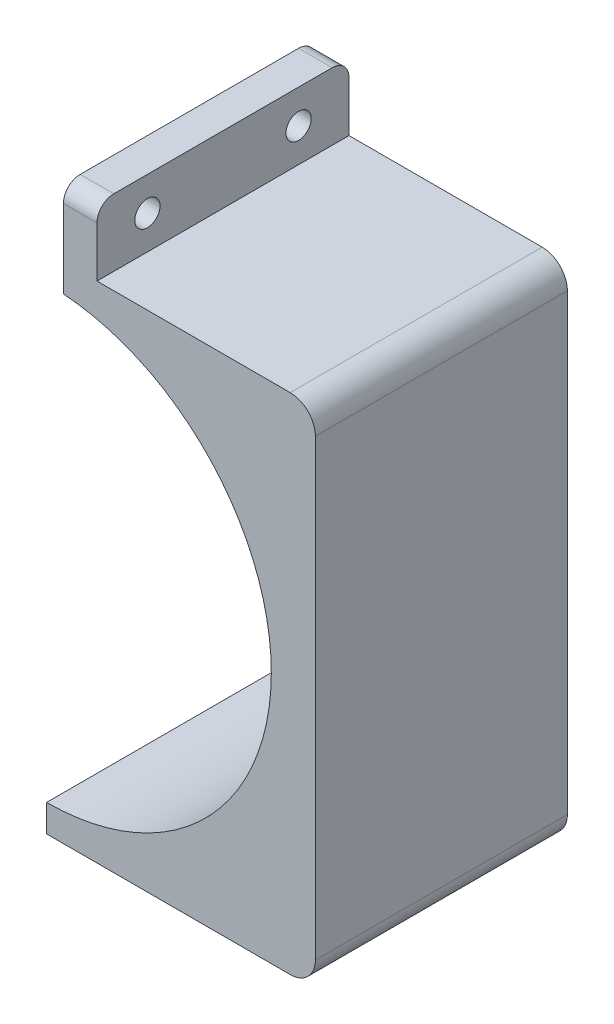
ISO-10303-21;
HEADER;
FILE_DESCRIPTION(('STEP AP214'),'2;1');
FILE_NAME('part.step','',(''),(''),'','','');
FILE_SCHEMA(('AUTOMOTIVE_DESIGN { 1 0 10303 214 1 1 1 1 }'));
ENDSEC;
DATA;
#1=APPLICATION_CONTEXT('core data for automotive mechanical design processes');
#2=APPLICATION_PROTOCOL_DEFINITION('international standard','automotive_design',2000,#1);
#3=PRODUCT_CONTEXT('',#1,'mechanical');
#4=PRODUCT('Part','Part','',(#3));
#5=PRODUCT_RELATED_PRODUCT_CATEGORY('part','',(#4));
#6=PRODUCT_DEFINITION_FORMATION('','',#4);
#7=PRODUCT_DEFINITION_CONTEXT('part definition',#1,'design');
#8=PRODUCT_DEFINITION('design','',#6,#7);
#9=PRODUCT_DEFINITION_SHAPE('','',#8);
#10=(LENGTH_UNIT() NAMED_UNIT(*) SI_UNIT(.MILLI.,.METRE.));
#11=(NAMED_UNIT(*) PLANE_ANGLE_UNIT() SI_UNIT($,.RADIAN.));
#12=(NAMED_UNIT(*) SI_UNIT($,.STERADIAN.) SOLID_ANGLE_UNIT());
#13=UNCERTAINTY_MEASURE_WITH_UNIT(LENGTH_MEASURE(1.E-05),#10,'distance_accuracy_value','');
#14=(GEOMETRIC_REPRESENTATION_CONTEXT(3) GLOBAL_UNCERTAINTY_ASSIGNED_CONTEXT((#13)) GLOBAL_UNIT_ASSIGNED_CONTEXT((#10,
#11,#12)) REPRESENTATION_CONTEXT('',''));
#15=CARTESIAN_POINT('',(0.,0.,0.));
#16=DIRECTION('',(0.,0.,1.));
#17=DIRECTION('',(1.,0.,0.));
#18=AXIS2_PLACEMENT_3D('',#15,#16,#17);
#19=CARTESIAN_POINT('',(32.,30.,30.));
#20=DIRECTION('',(-1.,0.,0.));
#21=DIRECTION('',(0.,-1.,0.));
#22=AXIS2_PLACEMENT_3D('',#19,#20,#21);
#23=PLANE('',#22);
#24=DIRECTION('',(0.,1.,0.));
#25=VECTOR('',#24,1.);
#26=CARTESIAN_POINT('',(32.,30.,30.));
#27=LINE('',#26,#25);
#28=CARTESIAN_POINT('',(32.,-27.,30.));
#29=VERTEX_POINT('',#28);
#30=CARTESIAN_POINT('',(32.,27.,30.));
#31=VERTEX_POINT('',#30);
#32=EDGE_CURVE('E156',#29,#31,#27,.T.);
#33=ORIENTED_EDGE('',*,*,#32,.F.);
#34=DIRECTION('',(0.,0.,-1.));
#35=VECTOR('',#34,1.);
#36=CARTESIAN_POINT('',(32.,-27.,30.));
#37=LINE('',#36,#35);
#38=CARTESIAN_POINT('',(32.,-27.,0.));
#39=VERTEX_POINT('',#38);
#40=EDGE_CURVE('E180',#29,#39,#37,.T.);
#41=ORIENTED_EDGE('',*,*,#40,.T.);
#42=DIRECTION('',(0.,1.,0.));
#43=VECTOR('',#42,1.);
#44=CARTESIAN_POINT('',(32.,30.,0.));
#45=LINE('',#44,#43);
#46=CARTESIAN_POINT('',(32.,27.,0.));
#47=VERTEX_POINT('',#46);
#48=EDGE_CURVE('E220',#39,#47,#45,.T.);
#49=ORIENTED_EDGE('',*,*,#48,.T.);
#50=DIRECTION('',(0.,0.,-1.));
#51=VECTOR('',#50,1.);
#52=CARTESIAN_POINT('',(32.,27.,30.));
#53=LINE('',#52,#51);
#54=EDGE_CURVE('E178',#47,#31,#53,.F.);
#55=ORIENTED_EDGE('',*,*,#54,.T.);
#56=EDGE_LOOP('',(#33,#41,#49,#55));
#57=FACE_BOUND('',#56,.T.);
#58=ADVANCED_FACE('F39',(#57),#23,.F.);
#59=CARTESIAN_POINT('',(6.,30.,30.));
#60=DIRECTION('',(0.,-1.,0.));
#61=DIRECTION('',(1.,0.,0.));
#62=AXIS2_PLACEMENT_3D('',#59,#60,#61);
#63=PLANE('',#62);
#64=DIRECTION('',(-1.,0.,0.));
#65=VECTOR('',#64,1.);
#66=CARTESIAN_POINT('',(6.,30.,30.));
#67=LINE('',#66,#65);
#68=CARTESIAN_POINT('',(29.,30.,30.));
#69=VERTEX_POINT('',#68);
#70=CARTESIAN_POINT('',(6.,30.,30.));
#71=VERTEX_POINT('',#70);
#72=EDGE_CURVE('E160',#69,#71,#67,.T.);
#73=ORIENTED_EDGE('',*,*,#72,.F.);
#74=DIRECTION('',(0.,0.,-1.));
#75=VECTOR('',#74,1.);
#76=CARTESIAN_POINT('',(29.,30.,30.));
#77=LINE('',#76,#75);
#78=CARTESIAN_POINT('',(29.,30.,0.));
#79=VERTEX_POINT('',#78);
#80=EDGE_CURVE('E142',#69,#79,#77,.T.);
#81=ORIENTED_EDGE('',*,*,#80,.T.);
#82=DIRECTION('',(-1.,0.,0.));
#83=VECTOR('',#82,1.);
#84=CARTESIAN_POINT('',(6.,30.,0.));
#85=LINE('',#84,#83);
#86=CARTESIAN_POINT('',(6.,30.,0.));
#87=VERTEX_POINT('',#86);
#88=EDGE_CURVE('E216',#79,#87,#85,.T.);
#89=ORIENTED_EDGE('',*,*,#88,.T.);
#90=DIRECTION('',(0.,0.,-1.));
#91=VECTOR('',#90,1.);
#92=CARTESIAN_POINT('',(6.,30.,30.));
#93=LINE('',#92,#91);
#94=EDGE_CURVE('E175',#71,#87,#93,.T.);
#95=ORIENTED_EDGE('',*,*,#94,.F.);
#96=EDGE_LOOP('',(#73,#81,#89,#95));
#97=FACE_BOUND('',#96,.T.);
#98=ADVANCED_FACE('F271',(#97),#63,.F.);
#99=CARTESIAN_POINT('',(6.,38.,30.));
#100=DIRECTION('',(-1.,0.,0.));
#101=DIRECTION('',(0.,-1.,0.));
#102=AXIS2_PLACEMENT_3D('',#99,#100,#101);
#103=PLANE('',#102);
#104=CARTESIAN_POINT('',(6.00000000000001,34.,24.));
#105=DIRECTION('',(1.,0.,0.));
#106=DIRECTION('',(0.,1.,0.));
#107=AXIS2_PLACEMENT_3D('',#104,#105,#106);
#108=CIRCLE('',#107,1.5);
#109=CARTESIAN_POINT('',(6.00000000000001,35.5,24.));
#110=VERTEX_POINT('',#109);
#111=EDGE_CURVE('E250',#110,#110,#108,.T.);
#112=ORIENTED_EDGE('',*,*,#111,.F.);
#113=EDGE_LOOP('',(#112));
#114=FACE_BOUND('',#113,.T.);
#115=CARTESIAN_POINT('',(6.00000000000001,34.,6.));
#116=DIRECTION('',(1.,0.,0.));
#117=DIRECTION('',(0.,1.,0.));
#118=AXIS2_PLACEMENT_3D('',#115,#116,#117);
#119=CIRCLE('',#118,1.5);
#120=CARTESIAN_POINT('',(6.00000000000001,35.5,6.));
#121=VERTEX_POINT('',#120);
#122=EDGE_CURVE('E251',#121,#121,#119,.T.);
#123=ORIENTED_EDGE('',*,*,#122,.F.);
#124=EDGE_LOOP('',(#123));
#125=FACE_BOUND('',#124,.T.);
#126=DIRECTION('',(0.,1.,0.));
#127=VECTOR('',#126,1.);
#128=CARTESIAN_POINT('',(6.,38.,0.));
#129=LINE('',#128,#127);
#130=CARTESIAN_POINT('',(6.,36.,0.));
#131=VERTEX_POINT('',#130);
#132=EDGE_CURVE('E205',#87,#131,#129,.T.);
#133=ORIENTED_EDGE('',*,*,#132,.T.);
#134=CARTESIAN_POINT('',(6.,36.,2.));
#135=DIRECTION('',(-1.,0.,0.));
#136=DIRECTION('',(0.,-1.,0.));
#137=AXIS2_PLACEMENT_3D('',#134,#135,#136);
#138=CIRCLE('',#137,2.);
#139=CARTESIAN_POINT('',(6.,38.,2.));
#140=VERTEX_POINT('',#139);
#141=EDGE_CURVE('E47',#131,#140,#138,.F.);
#142=ORIENTED_EDGE('',*,*,#141,.T.);
#143=DIRECTION('',(0.,0.,-1.));
#144=VECTOR('',#143,1.);
#145=CARTESIAN_POINT('',(6.,38.,30.));
#146=LINE('',#145,#144);
#147=CARTESIAN_POINT('',(6.,38.,28.));
#148=VERTEX_POINT('',#147);
#149=EDGE_CURVE('E172',#148,#140,#146,.T.);
#150=ORIENTED_EDGE('',*,*,#149,.F.);
#151=CARTESIAN_POINT('',(6.,36.,28.));
#152=DIRECTION('',(-1.,0.,0.));
#153=DIRECTION('',(0.,-1.,0.));
#154=AXIS2_PLACEMENT_3D('',#151,#152,#153);
#155=CIRCLE('',#154,2.);
#156=CARTESIAN_POINT('',(6.,36.,30.));
#157=VERTEX_POINT('',#156);
#158=EDGE_CURVE('E54',#148,#157,#155,.F.);
#159=ORIENTED_EDGE('',*,*,#158,.T.);
#160=DIRECTION('',(0.,1.,0.));
#161=VECTOR('',#160,1.);
#162=CARTESIAN_POINT('',(6.,38.,30.));
#163=LINE('',#162,#161);
#164=EDGE_CURVE('E230',#71,#157,#163,.T.);
#165=ORIENTED_EDGE('',*,*,#164,.F.);
#166=ORIENTED_EDGE('',*,*,#94,.T.);
#167=EDGE_LOOP('',(#133,#142,#150,#159,#165,#166));
#168=FACE_BOUND('',#167,.T.);
#169=ADVANCED_FACE('F204',(#114,#125,#168),#103,.F.);
#170=CARTESIAN_POINT('',(2.,38.,30.));
#171=DIRECTION('',(0.,-1.,0.));
#172=DIRECTION('',(0.,0.,-1.));
#173=AXIS2_PLACEMENT_3D('',#170,#171,#172);
#174=PLANE('',#173);
#175=ORIENTED_EDGE('',*,*,#149,.T.);
#176=DIRECTION('',(-1.,0.,0.));
#177=VECTOR('',#176,1.);
#178=CARTESIAN_POINT('',(2.,38.,2.));
#179=LINE('',#178,#177);
#180=CARTESIAN_POINT('',(2.,38.,2.));
#181=VERTEX_POINT('',#180);
#182=EDGE_CURVE('E195',#140,#181,#179,.T.);
#183=ORIENTED_EDGE('',*,*,#182,.T.);
#184=DIRECTION('',(0.,0.,-1.));
#185=VECTOR('',#184,1.);
#186=CARTESIAN_POINT('',(2.,38.,30.));
#187=LINE('',#186,#185);
#188=CARTESIAN_POINT('',(2.,38.,28.));
#189=VERTEX_POINT('',#188);
#190=EDGE_CURVE('E169',#189,#181,#187,.T.);
#191=ORIENTED_EDGE('',*,*,#190,.F.);
#192=DIRECTION('',(-1.,0.,0.));
#193=VECTOR('',#192,1.);
#194=CARTESIAN_POINT('',(6.,38.,28.));
#195=LINE('',#194,#193);
#196=EDGE_CURVE('E141',#189,#148,#195,.F.);
#197=ORIENTED_EDGE('',*,*,#196,.T.);
#198=EDGE_LOOP('',(#175,#183,#191,#197));
#199=FACE_BOUND('',#198,.T.);
#200=ADVANCED_FACE('F209',(#199),#174,.F.);
#201=CARTESIAN_POINT('',(2.,28.6593480251097,30.));
#202=DIRECTION('',(1.,0.,0.));
#203=DIRECTION('',(0.,1.,0.));
#204=AXIS2_PLACEMENT_3D('',#201,#202,#203);
#205=PLANE('',#204);
#206=CARTESIAN_POINT('',(2.,34.,24.));
#207=DIRECTION('',(1.,0.,0.));
#208=DIRECTION('',(0.,1.,0.));
#209=AXIS2_PLACEMENT_3D('',#206,#207,#208);
#210=CIRCLE('',#209,1.5);
#211=CARTESIAN_POINT('',(2.,35.5,24.));
#212=VERTEX_POINT('',#211);
#213=EDGE_CURVE('E237',#212,#212,#210,.T.);
#214=ORIENTED_EDGE('',*,*,#213,.T.);
#215=EDGE_LOOP('',(#214));
#216=FACE_BOUND('',#215,.T.);
#217=CARTESIAN_POINT('',(2.,34.,6.));
#218=DIRECTION('',(1.,0.,0.));
#219=DIRECTION('',(0.,1.,0.));
#220=AXIS2_PLACEMENT_3D('',#217,#218,#219);
#221=CIRCLE('',#220,1.5);
#222=CARTESIAN_POINT('',(2.,35.5,6.));
#223=VERTEX_POINT('',#222);
#224=EDGE_CURVE('E247',#223,#223,#221,.T.);
#225=ORIENTED_EDGE('',*,*,#224,.T.);
#226=EDGE_LOOP('',(#225));
#227=FACE_BOUND('',#226,.T.);
#228=ORIENTED_EDGE('',*,*,#190,.T.);
#229=CARTESIAN_POINT('',(2.,36.,2.));
#230=DIRECTION('',(1.,0.,0.));
#231=DIRECTION('',(0.,1.,0.));
#232=AXIS2_PLACEMENT_3D('',#229,#230,#231);
#233=CIRCLE('',#232,2.);
#234=CARTESIAN_POINT('',(2.,36.,0.));
#235=VERTEX_POINT('',#234);
#236=EDGE_CURVE('E200',#181,#235,#233,.F.);
#237=ORIENTED_EDGE('',*,*,#236,.T.);
#238=DIRECTION('',(0.,-1.,0.));
#239=VECTOR('',#238,1.);
#240=CARTESIAN_POINT('',(2.,28.6593480251097,0.));
#241=LINE('',#240,#239);
#242=CARTESIAN_POINT('',(2.,26.6751288656681,0.));
#243=VERTEX_POINT('',#242);
#244=EDGE_CURVE('E162',#235,#243,#241,.T.);
#245=ORIENTED_EDGE('',*,*,#244,.T.);
#246=DIRECTION('',(0.,0.,-1.));
#247=VECTOR('',#246,1.);
#248=CARTESIAN_POINT('',(2.,26.6751288656681,30.));
#249=LINE('',#248,#247);
#250=CARTESIAN_POINT('',(2.,26.6751288656681,30.));
#251=VERTEX_POINT('',#250);
#252=EDGE_CURVE('E166',#251,#243,#249,.T.);
#253=ORIENTED_EDGE('',*,*,#252,.F.);
#254=DIRECTION('',(0.,-1.,0.));
#255=VECTOR('',#254,1.);
#256=CARTESIAN_POINT('',(2.,38.,30.));
#257=LINE('',#256,#255);
#258=CARTESIAN_POINT('',(2.,36.,30.));
#259=VERTEX_POINT('',#258);
#260=EDGE_CURVE('E228',#259,#251,#257,.T.);
#261=ORIENTED_EDGE('',*,*,#260,.F.);
#262=CARTESIAN_POINT('',(2.,36.,28.));
#263=DIRECTION('',(1.,0.,0.));
#264=DIRECTION('',(0.,1.,0.));
#265=AXIS2_PLACEMENT_3D('',#262,#263,#264);
#266=CIRCLE('',#265,2.);
#267=EDGE_CURVE('E198',#259,#189,#266,.F.);
#268=ORIENTED_EDGE('',*,*,#267,.T.);
#269=EDGE_LOOP('',(#228,#237,#245,#253,#261,#268));
#270=FACE_BOUND('',#269,.T.);
#271=ADVANCED_FACE('F214',(#216,#227,#270),#205,.F.);
#272=CARTESIAN_POINT('',(0.,0.,30.));
#273=DIRECTION('',(0.,0.,-1.));
#274=DIRECTION('',(-1.,0.,0.));
#275=AXIS2_PLACEMENT_3D('',#272,#273,#274);
#276=CYLINDRICAL_SURFACE('',#275,26.75);
#277=CARTESIAN_POINT('',(0.,0.,0.));
#278=DIRECTION('',(0.,0.,-1.));
#279=DIRECTION('',(1.,0.,0.));
#280=AXIS2_PLACEMENT_3D('',#277,#278,#279);
#281=CIRCLE('',#280,26.75);
#282=CARTESIAN_POINT('',(0.,-26.75,0.));
#283=VERTEX_POINT('',#282);
#284=EDGE_CURVE('E157',#243,#283,#281,.T.);
#285=ORIENTED_EDGE('',*,*,#284,.T.);
#286=DIRECTION('',(0.,0.,-1.));
#287=VECTOR('',#286,1.);
#288=CARTESIAN_POINT('',(0.,-26.75,30.));
#289=LINE('',#288,#287);
#290=CARTESIAN_POINT('',(0.,-26.75,30.));
#291=VERTEX_POINT('',#290);
#292=EDGE_CURVE('E137',#283,#291,#289,.F.);
#293=ORIENTED_EDGE('',*,*,#292,.T.);
#294=CARTESIAN_POINT('',(0.,0.,30.));
#295=DIRECTION('',(0.,0.,-1.));
#296=DIRECTION('',(1.,0.,0.));
#297=AXIS2_PLACEMENT_3D('',#294,#295,#296);
#298=CIRCLE('',#297,26.75);
#299=EDGE_CURVE('E225',#251,#291,#298,.T.);
#300=ORIENTED_EDGE('',*,*,#299,.F.);
#301=ORIENTED_EDGE('',*,*,#252,.T.);
#302=EDGE_LOOP('',(#285,#293,#300,#301));
#303=FACE_BOUND('',#302,.T.);
#304=ADVANCED_FACE('F260',(#303),#276,.F.);
#305=CARTESIAN_POINT('',(-32.,-30.,30.));
#306=DIRECTION('',(0.,1.,0.));
#307=DIRECTION('',(0.,0.,1.));
#308=AXIS2_PLACEMENT_3D('',#305,#306,#307);
#309=PLANE('',#308);
#310=CARTESIAN_POINT('',(19.,-30.,24.));
#311=DIRECTION('',(0.,-1.,0.));
#312=DIRECTION('',(0.,0.,-1.));
#313=AXIS2_PLACEMENT_3D('',#310,#311,#312);
#314=CIRCLE('',#313,2.);
#315=CARTESIAN_POINT('',(19.,-30.,22.));
#316=VERTEX_POINT('',#315);
#317=EDGE_CURVE('E240',#316,#316,#314,.T.);
#318=ORIENTED_EDGE('',*,*,#317,.F.);
#319=EDGE_LOOP('',(#318));
#320=FACE_BOUND('',#319,.T.);
#321=CARTESIAN_POINT('',(19.,-30.,6.));
#322=DIRECTION('',(0.,-1.,0.));
#323=DIRECTION('',(0.,0.,-1.));
#324=AXIS2_PLACEMENT_3D('',#321,#322,#323);
#325=CIRCLE('',#324,2.);
#326=CARTESIAN_POINT('',(19.,-30.,4.));
#327=VERTEX_POINT('',#326);
#328=EDGE_CURVE('E236',#327,#327,#325,.T.);
#329=ORIENTED_EDGE('',*,*,#328,.F.);
#330=EDGE_LOOP('',(#329));
#331=FACE_BOUND('',#330,.T.);
#332=DIRECTION('',(1.,0.,0.));
#333=VECTOR('',#332,1.);
#334=CARTESIAN_POINT('',(-32.,-30.,30.));
#335=LINE('',#334,#333);
#336=CARTESIAN_POINT('',(0.,-30.,30.));
#337=VERTEX_POINT('',#336);
#338=CARTESIAN_POINT('',(29.,-30.,30.));
#339=VERTEX_POINT('',#338);
#340=EDGE_CURVE('E150',#337,#339,#335,.T.);
#341=ORIENTED_EDGE('',*,*,#340,.F.);
#342=DIRECTION('',(0.,0.,-1.));
#343=VECTOR('',#342,1.);
#344=CARTESIAN_POINT('',(0.,-30.,30.));
#345=LINE('',#344,#343);
#346=CARTESIAN_POINT('',(0.,-30.,0.));
#347=VERTEX_POINT('',#346);
#348=EDGE_CURVE('E134',#337,#347,#345,.T.);
#349=ORIENTED_EDGE('',*,*,#348,.T.);
#350=DIRECTION('',(1.,0.,0.));
#351=VECTOR('',#350,1.);
#352=CARTESIAN_POINT('',(-32.,-30.,0.));
#353=LINE('',#352,#351);
#354=CARTESIAN_POINT('',(29.,-30.,0.));
#355=VERTEX_POINT('',#354);
#356=EDGE_CURVE('E148',#347,#355,#353,.T.);
#357=ORIENTED_EDGE('',*,*,#356,.T.);
#358=DIRECTION('',(0.,0.,-1.));
#359=VECTOR('',#358,1.);
#360=CARTESIAN_POINT('',(29.,-30.,30.));
#361=LINE('',#360,#359);
#362=EDGE_CURVE('E186',#355,#339,#361,.F.);
#363=ORIENTED_EDGE('',*,*,#362,.T.);
#364=EDGE_LOOP('',(#341,#349,#357,#363));
#365=FACE_BOUND('',#364,.T.);
#366=ADVANCED_FACE('F146',(#320,#331,#365),#309,.F.);
#367=CARTESIAN_POINT('',(0.,0.,30.));
#368=DIRECTION('',(0.,0.,1.));
#369=DIRECTION('',(1.,0.,0.));
#370=AXIS2_PLACEMENT_3D('',#367,#368,#369);
#371=PLANE('',#370);
#372=ORIENTED_EDGE('',*,*,#164,.T.);
#373=DIRECTION('',(-1.,0.,0.));
#374=VECTOR('',#373,1.);
#375=CARTESIAN_POINT('',(2.,36.,30.));
#376=LINE('',#375,#374);
#377=EDGE_CURVE('E11',#157,#259,#376,.T.);
#378=ORIENTED_EDGE('',*,*,#377,.T.);
#379=ORIENTED_EDGE('',*,*,#260,.T.);
#380=ORIENTED_EDGE('',*,*,#299,.T.);
#381=DIRECTION('',(0.,1.,0.));
#382=VECTOR('',#381,1.);
#383=CARTESIAN_POINT('',(0.,0.,30.));
#384=LINE('',#383,#382);
#385=EDGE_CURVE('E254',#337,#291,#384,.T.);
#386=ORIENTED_EDGE('',*,*,#385,.F.);
#387=ORIENTED_EDGE('',*,*,#340,.T.);
#388=CARTESIAN_POINT('',(29.,-27.,30.));
#389=DIRECTION('',(0.,0.,1.));
#390=DIRECTION('',(1.,0.,0.));
#391=AXIS2_PLACEMENT_3D('',#388,#389,#390);
#392=CIRCLE('',#391,3.);
#393=EDGE_CURVE('E190',#339,#29,#392,.T.);
#394=ORIENTED_EDGE('',*,*,#393,.T.);
#395=ORIENTED_EDGE('',*,*,#32,.T.);
#396=CARTESIAN_POINT('',(29.,27.,30.));
#397=DIRECTION('',(0.,0.,1.));
#398=DIRECTION('',(1.,0.,0.));
#399=AXIS2_PLACEMENT_3D('',#396,#397,#398);
#400=CIRCLE('',#399,3.);
#401=EDGE_CURVE('E188',#31,#69,#400,.T.);
#402=ORIENTED_EDGE('',*,*,#401,.T.);
#403=ORIENTED_EDGE('',*,*,#72,.T.);
#404=EDGE_LOOP('',(#372,#378,#379,#380,#386,#387,#394,#395,#402,#403));
#405=FACE_BOUND('',#404,.T.);
#406=ADVANCED_FACE('F262',(#405),#371,.T.);
#407=CARTESIAN_POINT('',(0.,0.,0.));
#408=DIRECTION('',(0.,0.,1.));
#409=DIRECTION('',(1.,0.,0.));
#410=AXIS2_PLACEMENT_3D('',#407,#408,#409);
#411=PLANE('',#410);
#412=ORIENTED_EDGE('',*,*,#244,.F.);
#413=DIRECTION('',(-1.,0.,0.));
#414=VECTOR('',#413,1.);
#415=CARTESIAN_POINT('',(0.,36.,0.));
#416=LINE('',#415,#414);
#417=EDGE_CURVE('E62',#235,#131,#416,.F.);
#418=ORIENTED_EDGE('',*,*,#417,.T.);
#419=ORIENTED_EDGE('',*,*,#132,.F.);
#420=ORIENTED_EDGE('',*,*,#88,.F.);
#421=CARTESIAN_POINT('',(29.,27.,0.));
#422=DIRECTION('',(0.,0.,1.));
#423=DIRECTION('',(1.,0.,0.));
#424=AXIS2_PLACEMENT_3D('',#421,#422,#423);
#425=CIRCLE('',#424,3.);
#426=EDGE_CURVE('E183',#79,#47,#425,.F.);
#427=ORIENTED_EDGE('',*,*,#426,.T.);
#428=ORIENTED_EDGE('',*,*,#48,.F.);
#429=CARTESIAN_POINT('',(29.,-27.,0.));
#430=DIRECTION('',(0.,0.,1.));
#431=DIRECTION('',(1.,0.,0.));
#432=AXIS2_PLACEMENT_3D('',#429,#430,#431);
#433=CIRCLE('',#432,3.);
#434=EDGE_CURVE('E154',#39,#355,#433,.F.);
#435=ORIENTED_EDGE('',*,*,#434,.T.);
#436=ORIENTED_EDGE('',*,*,#356,.F.);
#437=DIRECTION('',(0.,1.,0.));
#438=VECTOR('',#437,1.);
#439=CARTESIAN_POINT('',(0.,0.,0.));
#440=LINE('',#439,#438);
#441=EDGE_CURVE('E131',#347,#283,#440,.T.);
#442=ORIENTED_EDGE('',*,*,#441,.T.);
#443=ORIENTED_EDGE('',*,*,#284,.F.);
#444=EDGE_LOOP('',(#412,#418,#419,#420,#427,#428,#435,#436,#442,#443));
#445=FACE_BOUND('',#444,.T.);
#446=ADVANCED_FACE('F152',(#445),#411,.F.);
#447=CARTESIAN_POINT('',(29.,-27.,30.));
#448=DIRECTION('',(0.,0.,-1.));
#449=DIRECTION('',(-1.,0.,0.));
#450=AXIS2_PLACEMENT_3D('',#447,#448,#449);
#451=CYLINDRICAL_SURFACE('',#450,3.);
#452=ORIENTED_EDGE('',*,*,#393,.F.);
#453=ORIENTED_EDGE('',*,*,#362,.F.);
#454=ORIENTED_EDGE('',*,*,#434,.F.);
#455=ORIENTED_EDGE('',*,*,#40,.F.);
#456=EDGE_LOOP('',(#452,#453,#454,#455));
#457=FACE_BOUND('',#456,.T.);
#458=ADVANCED_FACE('F282',(#457),#451,.T.);
#459=CARTESIAN_POINT('',(29.,27.,30.));
#460=DIRECTION('',(0.,0.,-1.));
#461=DIRECTION('',(-1.,0.,0.));
#462=AXIS2_PLACEMENT_3D('',#459,#460,#461);
#463=CYLINDRICAL_SURFACE('',#462,3.);
#464=ORIENTED_EDGE('',*,*,#401,.F.);
#465=ORIENTED_EDGE('',*,*,#54,.F.);
#466=ORIENTED_EDGE('',*,*,#426,.F.);
#467=ORIENTED_EDGE('',*,*,#80,.F.);
#468=EDGE_LOOP('',(#464,#465,#466,#467));
#469=FACE_BOUND('',#468,.T.);
#470=ADVANCED_FACE('F285',(#469),#463,.T.);
#471=CARTESIAN_POINT('',(19.,-23.,6.));
#472=DIRECTION('',(0.,-1.,0.));
#473=DIRECTION('',(0.,0.,-1.));
#474=AXIS2_PLACEMENT_3D('',#471,#472,#473);
#475=CYLINDRICAL_SURFACE('',#474,2.);
#476=CARTESIAN_POINT('',(19.,-23.,6.));
#477=DIRECTION('',(0.,-1.,0.));
#478=DIRECTION('',(0.,0.,-1.));
#479=AXIS2_PLACEMENT_3D('',#476,#477,#478);
#480=CIRCLE('',#479,2.);
#481=CARTESIAN_POINT('',(19.,-23.,4.));
#482=VERTEX_POINT('',#481);
#483=EDGE_CURVE('E233',#482,#482,#480,.T.);
#484=ORIENTED_EDGE('',*,*,#483,.F.);
#485=EDGE_LOOP('',(#484));
#486=FACE_BOUND('',#485,.T.);
#487=ORIENTED_EDGE('',*,*,#328,.T.);
#488=EDGE_LOOP('',(#487));
#489=FACE_BOUND('',#488,.T.);
#490=ADVANCED_FACE('F288',(#486,#489),#475,.F.);
#491=CARTESIAN_POINT('',(19.,-23.,6.));
#492=DIRECTION('',(0.,-1.,0.));
#493=DIRECTION('',(0.,0.,-1.));
#494=AXIS2_PLACEMENT_3D('',#491,#492,#493);
#495=PLANE('',#494);
#496=ORIENTED_EDGE('',*,*,#483,.T.);
#497=EDGE_LOOP('',(#496));
#498=FACE_BOUND('',#497,.T.);
#499=ADVANCED_FACE('F293',(#498),#495,.T.);
#500=CARTESIAN_POINT('',(19.,-23.,24.));
#501=DIRECTION('',(0.,-1.,0.));
#502=DIRECTION('',(0.,0.,-1.));
#503=AXIS2_PLACEMENT_3D('',#500,#501,#502);
#504=CYLINDRICAL_SURFACE('',#503,2.);
#505=CARTESIAN_POINT('',(19.,-23.,24.));
#506=DIRECTION('',(0.,-1.,0.));
#507=DIRECTION('',(0.,0.,-1.));
#508=AXIS2_PLACEMENT_3D('',#505,#506,#507);
#509=CIRCLE('',#508,2.);
#510=CARTESIAN_POINT('',(19.,-23.,22.));
#511=VERTEX_POINT('',#510);
#512=EDGE_CURVE('E223',#511,#511,#509,.T.);
#513=ORIENTED_EDGE('',*,*,#512,.F.);
#514=EDGE_LOOP('',(#513));
#515=FACE_BOUND('',#514,.T.);
#516=ORIENTED_EDGE('',*,*,#317,.T.);
#517=EDGE_LOOP('',(#516));
#518=FACE_BOUND('',#517,.T.);
#519=ADVANCED_FACE('F307',(#515,#518),#504,.F.);
#520=CARTESIAN_POINT('',(19.,-23.,24.));
#521=DIRECTION('',(0.,-1.,0.));
#522=DIRECTION('',(0.,0.,-1.));
#523=AXIS2_PLACEMENT_3D('',#520,#521,#522);
#524=PLANE('',#523);
#525=ORIENTED_EDGE('',*,*,#512,.T.);
#526=EDGE_LOOP('',(#525));
#527=FACE_BOUND('',#526,.T.);
#528=ADVANCED_FACE('F341',(#527),#524,.T.);
#529=CARTESIAN_POINT('',(-32.,34.,6.));
#530=DIRECTION('',(1.,0.,0.));
#531=DIRECTION('',(0.,1.,0.));
#532=AXIS2_PLACEMENT_3D('',#529,#530,#531);
#533=CYLINDRICAL_SURFACE('',#532,1.5);
#534=ORIENTED_EDGE('',*,*,#122,.T.);
#535=EDGE_LOOP('',(#534));
#536=FACE_BOUND('',#535,.T.);
#537=ORIENTED_EDGE('',*,*,#224,.F.);
#538=EDGE_LOOP('',(#537));
#539=FACE_BOUND('',#538,.T.);
#540=ADVANCED_FACE('F337',(#536,#539),#533,.F.);
#541=CARTESIAN_POINT('',(-32.,34.,24.));
#542=DIRECTION('',(1.,0.,0.));
#543=DIRECTION('',(0.,1.,0.));
#544=AXIS2_PLACEMENT_3D('',#541,#542,#543);
#545=CYLINDRICAL_SURFACE('',#544,1.5);
#546=ORIENTED_EDGE('',*,*,#111,.T.);
#547=EDGE_LOOP('',(#546));
#548=FACE_BOUND('',#547,.T.);
#549=ORIENTED_EDGE('',*,*,#213,.F.);
#550=EDGE_LOOP('',(#549));
#551=FACE_BOUND('',#550,.T.);
#552=ADVANCED_FACE('F340',(#548,#551),#545,.F.);
#553=CARTESIAN_POINT('',(0.,0.,0.));
#554=DIRECTION('',(1.,0.,0.));
#555=DIRECTION('',(0.,1.,0.));
#556=AXIS2_PLACEMENT_3D('',#553,#554,#555);
#557=PLANE('',#556);
#558=ORIENTED_EDGE('',*,*,#385,.T.);
#559=ORIENTED_EDGE('',*,*,#292,.F.);
#560=ORIENTED_EDGE('',*,*,#441,.F.);
#561=ORIENTED_EDGE('',*,*,#348,.F.);
#562=EDGE_LOOP('',(#558,#559,#560,#561));
#563=FACE_BOUND('',#562,.T.);
#564=ADVANCED_FACE('F133',(#563),#557,.F.);
#565=CARTESIAN_POINT('',(2.,36.,2.));
#566=DIRECTION('',(-1.,0.,0.));
#567=DIRECTION('',(0.,0.,1.));
#568=AXIS2_PLACEMENT_3D('',#565,#566,#567);
#569=CYLINDRICAL_SURFACE('',#568,2.);
#570=ORIENTED_EDGE('',*,*,#141,.F.);
#571=ORIENTED_EDGE('',*,*,#417,.F.);
#572=ORIENTED_EDGE('',*,*,#236,.F.);
#573=ORIENTED_EDGE('',*,*,#182,.F.);
#574=EDGE_LOOP('',(#570,#571,#572,#573));
#575=FACE_BOUND('',#574,.T.);
#576=ADVANCED_FACE('F212',(#575),#569,.T.);
#577=CARTESIAN_POINT('',(0.,36.,28.));
#578=DIRECTION('',(1.,0.,0.));
#579=DIRECTION('',(0.,0.,-1.));
#580=AXIS2_PLACEMENT_3D('',#577,#578,#579);
#581=CYLINDRICAL_SURFACE('',#580,2.);
#582=ORIENTED_EDGE('',*,*,#158,.F.);
#583=ORIENTED_EDGE('',*,*,#196,.F.);
#584=ORIENTED_EDGE('',*,*,#267,.F.);
#585=ORIENTED_EDGE('',*,*,#377,.F.);
#586=EDGE_LOOP('',(#582,#583,#584,#585));
#587=FACE_BOUND('',#586,.T.);
#588=ADVANCED_FACE('F41',(#587),#581,.T.);
#589=CLOSED_SHELL('',(#58,#98,#169,#200,#271,#304,#366,#406,#446,#458,#470,#490,#499,#519,#528,
#540,#552,#564,#576,#588));
#590=MANIFOLD_SOLID_BREP('B2',#589);
#591=ADVANCED_BREP_SHAPE_REPRESENTATION('',(#18,#590),#14);
#592=SHAPE_DEFINITION_REPRESENTATION(#9,#591);
ENDSEC;
END-ISO-10303-21;
